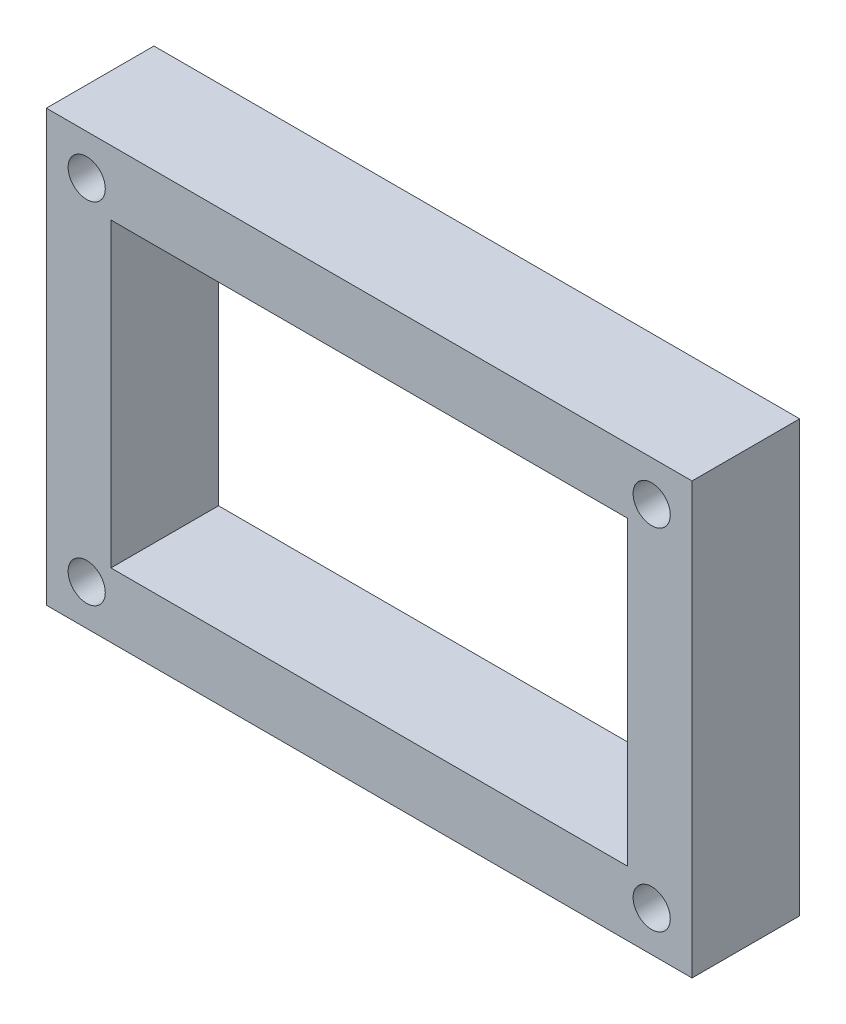
ISO-10303-21;
HEADER;
FILE_DESCRIPTION(('STEP AP214'),'2;1');
FILE_NAME('part.step','',(''),(''),'','','');
FILE_SCHEMA(('AUTOMOTIVE_DESIGN { 1 0 10303 214 1 1 1 1 }'));
ENDSEC;
DATA;
#1=APPLICATION_CONTEXT('core data for automotive mechanical design processes');
#2=APPLICATION_PROTOCOL_DEFINITION('international standard','automotive_design',2000,#1);
#3=PRODUCT_CONTEXT('',#1,'mechanical');
#4=PRODUCT('Part','Part','',(#3));
#5=PRODUCT_RELATED_PRODUCT_CATEGORY('part','',(#4));
#6=PRODUCT_DEFINITION_FORMATION('','',#4);
#7=PRODUCT_DEFINITION_CONTEXT('part definition',#1,'design');
#8=PRODUCT_DEFINITION('design','',#6,#7);
#9=PRODUCT_DEFINITION_SHAPE('','',#8);
#10=(LENGTH_UNIT() NAMED_UNIT(*) SI_UNIT(.MILLI.,.METRE.));
#11=(NAMED_UNIT(*) PLANE_ANGLE_UNIT() SI_UNIT($,.RADIAN.));
#12=(NAMED_UNIT(*) SI_UNIT($,.STERADIAN.) SOLID_ANGLE_UNIT());
#13=UNCERTAINTY_MEASURE_WITH_UNIT(LENGTH_MEASURE(1.E-05),#10,'distance_accuracy_value','');
#14=(GEOMETRIC_REPRESENTATION_CONTEXT(3) GLOBAL_UNCERTAINTY_ASSIGNED_CONTEXT((#13)) GLOBAL_UNIT_ASSIGNED_CONTEXT((#10,
#11,#12)) REPRESENTATION_CONTEXT('',''));
#15=CARTESIAN_POINT('',(0.,0.,0.));
#16=DIRECTION('',(0.,0.,1.));
#17=DIRECTION('',(1.,0.,0.));
#18=AXIS2_PLACEMENT_3D('',#15,#16,#17);
#19=CARTESIAN_POINT('',(0.,-20.,10.));
#20=DIRECTION('',(0.,-1.,0.));
#21=DIRECTION('',(1.,0.,0.));
#22=AXIS2_PLACEMENT_3D('',#19,#20,#21);
#23=PLANE('',#22);
#24=DIRECTION('',(-1.,0.,0.));
#25=VECTOR('',#24,1.);
#26=CARTESIAN_POINT('',(0.,-20.,0.));
#27=LINE('',#26,#25);
#28=CARTESIAN_POINT('',(30.,-20.,0.));
#29=VERTEX_POINT('',#28);
#30=CARTESIAN_POINT('',(-30.,-20.,0.));
#31=VERTEX_POINT('',#30);
#32=EDGE_CURVE('E221',#29,#31,#27,.T.);
#33=ORIENTED_EDGE('',*,*,#32,.F.);
#34=DIRECTION('',(0.,0.,-1.));
#35=VECTOR('',#34,1.);
#36=CARTESIAN_POINT('',(30.,-20.,10.));
#37=LINE('',#36,#35);
#38=CARTESIAN_POINT('',(30.,-20.,10.));
#39=VERTEX_POINT('',#38);
#40=EDGE_CURVE('E10',#39,#29,#37,.T.);
#41=ORIENTED_EDGE('',*,*,#40,.F.);
#42=DIRECTION('',(-1.,0.,0.));
#43=VECTOR('',#42,1.);
#44=CARTESIAN_POINT('',(0.,-20.,10.));
#45=LINE('',#44,#43);
#46=CARTESIAN_POINT('',(-30.,-20.,10.));
#47=VERTEX_POINT('',#46);
#48=EDGE_CURVE('E126',#39,#47,#45,.T.);
#49=ORIENTED_EDGE('',*,*,#48,.T.);
#50=DIRECTION('',(0.,0.,-1.));
#51=VECTOR('',#50,1.);
#52=CARTESIAN_POINT('',(-30.,-20.,10.));
#53=LINE('',#52,#51);
#54=EDGE_CURVE('E41',#47,#31,#53,.T.);
#55=ORIENTED_EDGE('',*,*,#54,.T.);
#56=EDGE_LOOP('',(#33,#41,#49,#55));
#57=FACE_BOUND('',#56,.T.);
#58=ADVANCED_FACE('F16',(#57),#23,.T.);
#59=CARTESIAN_POINT('',(30.,0.,10.));
#60=DIRECTION('',(-1.,0.,0.));
#61=DIRECTION('',(0.,0.,1.));
#62=AXIS2_PLACEMENT_3D('',#59,#60,#61);
#63=PLANE('',#62);
#64=DIRECTION('',(0.,1.,0.));
#65=VECTOR('',#64,1.);
#66=CARTESIAN_POINT('',(30.,0.,0.));
#67=LINE('',#66,#65);
#68=CARTESIAN_POINT('',(30.,20.,0.));
#69=VERTEX_POINT('',#68);
#70=EDGE_CURVE('E132',#29,#69,#67,.T.);
#71=ORIENTED_EDGE('',*,*,#70,.T.);
#72=DIRECTION('',(0.,0.,-1.));
#73=VECTOR('',#72,1.);
#74=CARTESIAN_POINT('',(30.,20.,10.));
#75=LINE('',#74,#73);
#76=CARTESIAN_POINT('',(30.,20.,10.));
#77=VERTEX_POINT('',#76);
#78=EDGE_CURVE('E27',#77,#69,#75,.T.);
#79=ORIENTED_EDGE('',*,*,#78,.F.);
#80=DIRECTION('',(0.,1.,0.));
#81=VECTOR('',#80,1.);
#82=CARTESIAN_POINT('',(30.,0.,10.));
#83=LINE('',#82,#81);
#84=EDGE_CURVE('E121',#39,#77,#83,.T.);
#85=ORIENTED_EDGE('',*,*,#84,.F.);
#86=ORIENTED_EDGE('',*,*,#40,.T.);
#87=EDGE_LOOP('',(#71,#79,#85,#86));
#88=FACE_BOUND('',#87,.T.);
#89=ADVANCED_FACE('F130',(#88),#63,.F.);
#90=CARTESIAN_POINT('',(0.,20.,10.));
#91=DIRECTION('',(0.,-1.,0.));
#92=DIRECTION('',(1.,0.,0.));
#93=AXIS2_PLACEMENT_3D('',#90,#91,#92);
#94=PLANE('',#93);
#95=DIRECTION('',(-1.,0.,0.));
#96=VECTOR('',#95,1.);
#97=CARTESIAN_POINT('',(0.,20.,0.));
#98=LINE('',#97,#96);
#99=CARTESIAN_POINT('',(-30.,20.,0.));
#100=VERTEX_POINT('',#99);
#101=EDGE_CURVE('E226',#69,#100,#98,.T.);
#102=ORIENTED_EDGE('',*,*,#101,.T.);
#103=DIRECTION('',(0.,0.,-1.));
#104=VECTOR('',#103,1.);
#105=CARTESIAN_POINT('',(-30.,20.,10.));
#106=LINE('',#105,#104);
#107=CARTESIAN_POINT('',(-30.,20.,10.));
#108=VERTEX_POINT('',#107);
#109=EDGE_CURVE('E76',#108,#100,#106,.T.);
#110=ORIENTED_EDGE('',*,*,#109,.F.);
#111=DIRECTION('',(-1.,0.,0.));
#112=VECTOR('',#111,1.);
#113=CARTESIAN_POINT('',(0.,20.,10.));
#114=LINE('',#113,#112);
#115=EDGE_CURVE('E112',#77,#108,#114,.T.);
#116=ORIENTED_EDGE('',*,*,#115,.F.);
#117=ORIENTED_EDGE('',*,*,#78,.T.);
#118=EDGE_LOOP('',(#102,#110,#116,#117));
#119=FACE_BOUND('',#118,.T.);
#120=ADVANCED_FACE('F114',(#119),#94,.F.);
#121=CARTESIAN_POINT('',(24.,0.,10.));
#122=DIRECTION('',(-1.,0.,0.));
#123=DIRECTION('',(0.,0.,1.));
#124=AXIS2_PLACEMENT_3D('',#121,#122,#123);
#125=PLANE('',#124);
#126=DIRECTION('',(0.,1.,0.));
#127=VECTOR('',#126,1.);
#128=CARTESIAN_POINT('',(24.,0.,0.));
#129=LINE('',#128,#127);
#130=CARTESIAN_POINT('',(24.,-14.,0.));
#131=VERTEX_POINT('',#130);
#132=CARTESIAN_POINT('',(24.,14.,0.));
#133=VERTEX_POINT('',#132);
#134=EDGE_CURVE('E157',#131,#133,#129,.T.);
#135=ORIENTED_EDGE('',*,*,#134,.F.);
#136=DIRECTION('',(0.,0.,-1.));
#137=VECTOR('',#136,1.);
#138=CARTESIAN_POINT('',(24.,-14.,10.));
#139=LINE('',#138,#137);
#140=CARTESIAN_POINT('',(24.,-14.,10.));
#141=VERTEX_POINT('',#140);
#142=EDGE_CURVE('E92',#141,#131,#139,.T.);
#143=ORIENTED_EDGE('',*,*,#142,.F.);
#144=DIRECTION('',(0.,1.,0.));
#145=VECTOR('',#144,1.);
#146=CARTESIAN_POINT('',(24.,0.,10.));
#147=LINE('',#146,#145);
#148=CARTESIAN_POINT('',(24.,14.,10.));
#149=VERTEX_POINT('',#148);
#150=EDGE_CURVE('E189',#141,#149,#147,.T.);
#151=ORIENTED_EDGE('',*,*,#150,.T.);
#152=DIRECTION('',(0.,0.,-1.));
#153=VECTOR('',#152,1.);
#154=CARTESIAN_POINT('',(24.,14.,10.));
#155=LINE('',#154,#153);
#156=EDGE_CURVE('E141',#149,#133,#155,.T.);
#157=ORIENTED_EDGE('',*,*,#156,.T.);
#158=EDGE_LOOP('',(#135,#143,#151,#157));
#159=FACE_BOUND('',#158,.T.);
#160=ADVANCED_FACE('F18',(#159),#125,.T.);
#161=CARTESIAN_POINT('',(0.,-14.,10.));
#162=DIRECTION('',(0.,-1.,0.));
#163=DIRECTION('',(1.,0.,0.));
#164=AXIS2_PLACEMENT_3D('',#161,#162,#163);
#165=PLANE('',#164);
#166=DIRECTION('',(-1.,0.,0.));
#167=VECTOR('',#166,1.);
#168=CARTESIAN_POINT('',(0.,-14.,0.));
#169=LINE('',#168,#167);
#170=CARTESIAN_POINT('',(-24.,-14.,0.));
#171=VERTEX_POINT('',#170);
#172=EDGE_CURVE('E210',#131,#171,#169,.T.);
#173=ORIENTED_EDGE('',*,*,#172,.T.);
#174=DIRECTION('',(0.,0.,-1.));
#175=VECTOR('',#174,1.);
#176=CARTESIAN_POINT('',(-24.,-14.,10.));
#177=LINE('',#176,#175);
#178=CARTESIAN_POINT('',(-24.,-14.,10.));
#179=VERTEX_POINT('',#178);
#180=EDGE_CURVE('E147',#179,#171,#177,.T.);
#181=ORIENTED_EDGE('',*,*,#180,.F.);
#182=DIRECTION('',(-1.,0.,0.));
#183=VECTOR('',#182,1.);
#184=CARTESIAN_POINT('',(0.,-14.,10.));
#185=LINE('',#184,#183);
#186=EDGE_CURVE('E192',#141,#179,#185,.T.);
#187=ORIENTED_EDGE('',*,*,#186,.F.);
#188=ORIENTED_EDGE('',*,*,#142,.T.);
#189=EDGE_LOOP('',(#173,#181,#187,#188));
#190=FACE_BOUND('',#189,.T.);
#191=ADVANCED_FACE('F267',(#190),#165,.F.);
#192=CARTESIAN_POINT('',(-24.,0.,10.));
#193=DIRECTION('',(-1.,0.,0.));
#194=DIRECTION('',(0.,0.,1.));
#195=AXIS2_PLACEMENT_3D('',#192,#193,#194);
#196=PLANE('',#195);
#197=DIRECTION('',(0.,1.,0.));
#198=VECTOR('',#197,1.);
#199=CARTESIAN_POINT('',(-24.,0.,0.));
#200=LINE('',#199,#198);
#201=CARTESIAN_POINT('',(-24.,14.,0.));
#202=VERTEX_POINT('',#201);
#203=EDGE_CURVE('E213',#171,#202,#200,.T.);
#204=ORIENTED_EDGE('',*,*,#203,.T.);
#205=DIRECTION('',(0.,0.,-1.));
#206=VECTOR('',#205,1.);
#207=CARTESIAN_POINT('',(-24.,14.,10.));
#208=LINE('',#207,#206);
#209=CARTESIAN_POINT('',(-24.,14.,10.));
#210=VERTEX_POINT('',#209);
#211=EDGE_CURVE('E144',#210,#202,#208,.T.);
#212=ORIENTED_EDGE('',*,*,#211,.F.);
#213=DIRECTION('',(0.,1.,0.));
#214=VECTOR('',#213,1.);
#215=CARTESIAN_POINT('',(-24.,0.,10.));
#216=LINE('',#215,#214);
#217=EDGE_CURVE('E196',#179,#210,#216,.T.);
#218=ORIENTED_EDGE('',*,*,#217,.F.);
#219=ORIENTED_EDGE('',*,*,#180,.T.);
#220=EDGE_LOOP('',(#204,#212,#218,#219));
#221=FACE_BOUND('',#220,.T.);
#222=ADVANCED_FACE('F254',(#221),#196,.F.);
#223=CARTESIAN_POINT('',(0.,14.,10.));
#224=DIRECTION('',(0.,-1.,0.));
#225=DIRECTION('',(1.,0.,0.));
#226=AXIS2_PLACEMENT_3D('',#223,#224,#225);
#227=PLANE('',#226);
#228=DIRECTION('',(-1.,0.,0.));
#229=VECTOR('',#228,1.);
#230=CARTESIAN_POINT('',(0.,14.,0.));
#231=LINE('',#230,#229);
#232=EDGE_CURVE('E217',#133,#202,#231,.T.);
#233=ORIENTED_EDGE('',*,*,#232,.F.);
#234=ORIENTED_EDGE('',*,*,#156,.F.);
#235=DIRECTION('',(-1.,0.,0.));
#236=VECTOR('',#235,1.);
#237=CARTESIAN_POINT('',(0.,14.,10.));
#238=LINE('',#237,#236);
#239=EDGE_CURVE('E199',#149,#210,#238,.T.);
#240=ORIENTED_EDGE('',*,*,#239,.T.);
#241=ORIENTED_EDGE('',*,*,#211,.T.);
#242=EDGE_LOOP('',(#233,#234,#240,#241));
#243=FACE_BOUND('',#242,.T.);
#244=ADVANCED_FACE('F245',(#243),#227,.T.);
#245=CARTESIAN_POINT('',(-30.,0.,10.));
#246=DIRECTION('',(-1.,0.,0.));
#247=DIRECTION('',(0.,0.,1.));
#248=AXIS2_PLACEMENT_3D('',#245,#246,#247);
#249=PLANE('',#248);
#250=DIRECTION('',(0.,1.,0.));
#251=VECTOR('',#250,1.);
#252=CARTESIAN_POINT('',(-30.,0.,0.));
#253=LINE('',#252,#251);
#254=EDGE_CURVE('E193',#31,#100,#253,.T.);
#255=ORIENTED_EDGE('',*,*,#254,.F.);
#256=ORIENTED_EDGE('',*,*,#54,.F.);
#257=DIRECTION('',(0.,1.,0.));
#258=VECTOR('',#257,1.);
#259=CARTESIAN_POINT('',(-30.,0.,10.));
#260=LINE('',#259,#258);
#261=EDGE_CURVE('E120',#47,#108,#260,.T.);
#262=ORIENTED_EDGE('',*,*,#261,.T.);
#263=ORIENTED_EDGE('',*,*,#109,.T.);
#264=EDGE_LOOP('',(#255,#256,#262,#263));
#265=FACE_BOUND('',#264,.T.);
#266=ADVANCED_FACE('F243',(#265),#249,.T.);
#267=CARTESIAN_POINT('',(0.,0.,10.));
#268=DIRECTION('',(0.,0.,1.));
#269=DIRECTION('',(1.,0.,0.));
#270=AXIS2_PLACEMENT_3D('',#267,#268,#269);
#271=PLANE('',#270);
#272=CARTESIAN_POINT('',(26.25,16.25,10.));
#273=DIRECTION('',(0.,0.,1.));
#274=DIRECTION('',(-1.,0.,0.));
#275=AXIS2_PLACEMENT_3D('',#272,#273,#274);
#276=CIRCLE('',#275,1.727);
#277=CARTESIAN_POINT('',(24.523,16.25,10.));
#278=VERTEX_POINT('',#277);
#279=EDGE_CURVE('E183',#278,#278,#276,.T.);
#280=ORIENTED_EDGE('',*,*,#279,.F.);
#281=EDGE_LOOP('',(#280));
#282=FACE_BOUND('',#281,.T.);
#283=CARTESIAN_POINT('',(26.25,-16.25,10.));
#284=DIRECTION('',(0.,0.,-1.));
#285=DIRECTION('',(-1.,0.,0.));
#286=AXIS2_PLACEMENT_3D('',#283,#284,#285);
#287=CIRCLE('',#286,1.727);
#288=CARTESIAN_POINT('',(24.523,-16.25,10.));
#289=VERTEX_POINT('',#288);
#290=EDGE_CURVE('E166',#289,#289,#287,.T.);
#291=ORIENTED_EDGE('',*,*,#290,.T.);
#292=EDGE_LOOP('',(#291));
#293=FACE_BOUND('',#292,.T.);
#294=CARTESIAN_POINT('',(-26.25,16.25,10.));
#295=DIRECTION('',(0.,0.,-1.));
#296=DIRECTION('',(1.,0.,0.));
#297=AXIS2_PLACEMENT_3D('',#294,#295,#296);
#298=CIRCLE('',#297,1.727);
#299=CARTESIAN_POINT('',(-24.523,16.25,10.));
#300=VERTEX_POINT('',#299);
#301=EDGE_CURVE('E162',#300,#300,#298,.T.);
#302=ORIENTED_EDGE('',*,*,#301,.T.);
#303=EDGE_LOOP('',(#302));
#304=FACE_BOUND('',#303,.T.);
#305=CARTESIAN_POINT('',(-26.25,-16.25,10.));
#306=DIRECTION('',(0.,0.,1.));
#307=DIRECTION('',(1.,0.,0.));
#308=AXIS2_PLACEMENT_3D('',#305,#306,#307);
#309=CIRCLE('',#308,1.727);
#310=CARTESIAN_POINT('',(-24.523,-16.25,10.));
#311=VERTEX_POINT('',#310);
#312=EDGE_CURVE('E158',#311,#311,#309,.T.);
#313=ORIENTED_EDGE('',*,*,#312,.F.);
#314=EDGE_LOOP('',(#313));
#315=FACE_BOUND('',#314,.T.);
#316=ORIENTED_EDGE('',*,*,#150,.F.);
#317=ORIENTED_EDGE('',*,*,#186,.T.);
#318=ORIENTED_EDGE('',*,*,#217,.T.);
#319=ORIENTED_EDGE('',*,*,#239,.F.);
#320=EDGE_LOOP('',(#316,#317,#318,#319));
#321=FACE_BOUND('',#320,.T.);
#322=ORIENTED_EDGE('',*,*,#48,.F.);
#323=ORIENTED_EDGE('',*,*,#84,.T.);
#324=ORIENTED_EDGE('',*,*,#115,.T.);
#325=ORIENTED_EDGE('',*,*,#261,.F.);
#326=EDGE_LOOP('',(#322,#323,#324,#325));
#327=FACE_BOUND('',#326,.T.);
#328=ADVANCED_FACE('F125',(#282,#293,#304,#315,#321,#327),#271,.T.);
#329=CARTESIAN_POINT('',(0.,0.,0.));
#330=DIRECTION('',(0.,0.,1.));
#331=DIRECTION('',(1.,0.,0.));
#332=AXIS2_PLACEMENT_3D('',#329,#330,#331);
#333=PLANE('',#332);
#334=CARTESIAN_POINT('',(26.25,16.25,0.));
#335=DIRECTION('',(0.,0.,1.));
#336=DIRECTION('',(1.,0.,0.));
#337=AXIS2_PLACEMENT_3D('',#334,#335,#336);
#338=CIRCLE('',#337,1.727);
#339=CARTESIAN_POINT('',(27.977,16.25,0.));
#340=VERTEX_POINT('',#339);
#341=EDGE_CURVE('E20',#340,#340,#338,.T.);
#342=ORIENTED_EDGE('',*,*,#341,.T.);
#343=EDGE_LOOP('',(#342));
#344=FACE_BOUND('',#343,.T.);
#345=CARTESIAN_POINT('',(26.25,-16.25,0.));
#346=DIRECTION('',(0.,0.,1.));
#347=DIRECTION('',(1.,0.,0.));
#348=AXIS2_PLACEMENT_3D('',#345,#346,#347);
#349=CIRCLE('',#348,1.727);
#350=CARTESIAN_POINT('',(27.977,-16.25,0.));
#351=VERTEX_POINT('',#350);
#352=EDGE_CURVE('E163',#351,#351,#349,.F.);
#353=ORIENTED_EDGE('',*,*,#352,.F.);
#354=EDGE_LOOP('',(#353));
#355=FACE_BOUND('',#354,.T.);
#356=CARTESIAN_POINT('',(-26.25,16.25,0.));
#357=DIRECTION('',(0.,0.,1.));
#358=DIRECTION('',(1.,0.,0.));
#359=AXIS2_PLACEMENT_3D('',#356,#357,#358);
#360=CIRCLE('',#359,1.727);
#361=CARTESIAN_POINT('',(-24.523,16.25,0.));
#362=VERTEX_POINT('',#361);
#363=EDGE_CURVE('E159',#362,#362,#360,.F.);
#364=ORIENTED_EDGE('',*,*,#363,.F.);
#365=EDGE_LOOP('',(#364));
#366=FACE_BOUND('',#365,.T.);
#367=CARTESIAN_POINT('',(-26.25,-16.25,0.));
#368=DIRECTION('',(0.,0.,1.));
#369=DIRECTION('',(1.,0.,0.));
#370=AXIS2_PLACEMENT_3D('',#367,#368,#369);
#371=CIRCLE('',#370,1.727);
#372=CARTESIAN_POINT('',(-24.523,-16.25,0.));
#373=VERTEX_POINT('',#372);
#374=EDGE_CURVE('E153',#373,#373,#371,.T.);
#375=ORIENTED_EDGE('',*,*,#374,.T.);
#376=EDGE_LOOP('',(#375));
#377=FACE_BOUND('',#376,.T.);
#378=ORIENTED_EDGE('',*,*,#134,.T.);
#379=ORIENTED_EDGE('',*,*,#232,.T.);
#380=ORIENTED_EDGE('',*,*,#203,.F.);
#381=ORIENTED_EDGE('',*,*,#172,.F.);
#382=EDGE_LOOP('',(#378,#379,#380,#381));
#383=FACE_BOUND('',#382,.T.);
#384=ORIENTED_EDGE('',*,*,#32,.T.);
#385=ORIENTED_EDGE('',*,*,#254,.T.);
#386=ORIENTED_EDGE('',*,*,#101,.F.);
#387=ORIENTED_EDGE('',*,*,#70,.F.);
#388=EDGE_LOOP('',(#384,#385,#386,#387));
#389=FACE_BOUND('',#388,.T.);
#390=ADVANCED_FACE('F242',(#344,#355,#366,#377,#383,#389),#333,.F.);
#391=CARTESIAN_POINT('',(-26.25,-16.25,-62.8110988928052));
#392=DIRECTION('',(0.,0.,1.));
#393=DIRECTION('',(1.,0.,0.));
#394=AXIS2_PLACEMENT_3D('',#391,#392,#393);
#395=CYLINDRICAL_SURFACE('',#394,1.727);
#396=ORIENTED_EDGE('',*,*,#312,.T.);
#397=EDGE_LOOP('',(#396));
#398=FACE_BOUND('',#397,.T.);
#399=ORIENTED_EDGE('',*,*,#374,.F.);
#400=EDGE_LOOP('',(#399));
#401=FACE_BOUND('',#400,.T.);
#402=ADVANCED_FACE('F285',(#398,#401),#395,.F.);
#403=CARTESIAN_POINT('',(-26.25,16.25,-62.8110988928052));
#404=DIRECTION('',(0.,0.,1.));
#405=DIRECTION('',(1.,0.,0.));
#406=AXIS2_PLACEMENT_3D('',#403,#404,#405);
#407=CYLINDRICAL_SURFACE('',#406,1.727);
#408=ORIENTED_EDGE('',*,*,#301,.F.);
#409=EDGE_LOOP('',(#408));
#410=FACE_BOUND('',#409,.T.);
#411=ORIENTED_EDGE('',*,*,#363,.T.);
#412=EDGE_LOOP('',(#411));
#413=FACE_BOUND('',#412,.T.);
#414=ADVANCED_FACE('F290',(#410,#413),#407,.F.);
#415=CARTESIAN_POINT('',(26.25,-16.25,-62.8110988928052));
#416=DIRECTION('',(0.,0.,1.));
#417=DIRECTION('',(1.,0.,0.));
#418=AXIS2_PLACEMENT_3D('',#415,#416,#417);
#419=CYLINDRICAL_SURFACE('',#418,1.727);
#420=ORIENTED_EDGE('',*,*,#290,.F.);
#421=EDGE_LOOP('',(#420));
#422=FACE_BOUND('',#421,.T.);
#423=ORIENTED_EDGE('',*,*,#352,.T.);
#424=EDGE_LOOP('',(#423));
#425=FACE_BOUND('',#424,.T.);
#426=ADVANCED_FACE('F297',(#422,#425),#419,.F.);
#427=CARTESIAN_POINT('',(26.25,16.25,-62.8110988928052));
#428=DIRECTION('',(0.,0.,1.));
#429=DIRECTION('',(1.,0.,0.));
#430=AXIS2_PLACEMENT_3D('',#427,#428,#429);
#431=CYLINDRICAL_SURFACE('',#430,1.727);
#432=ORIENTED_EDGE('',*,*,#279,.T.);
#433=EDGE_LOOP('',(#432));
#434=FACE_BOUND('',#433,.T.);
#435=ORIENTED_EDGE('',*,*,#341,.F.);
#436=EDGE_LOOP('',(#435));
#437=FACE_BOUND('',#436,.T.);
#438=ADVANCED_FACE('F301',(#434,#437),#431,.F.);
#439=CLOSED_SHELL('',(#58,#89,#120,#160,#191,#222,#244,#266,#328,#390,#402,#414,#426,#438));
#440=MANIFOLD_SOLID_BREP('B1',#439);
#441=ADVANCED_BREP_SHAPE_REPRESENTATION('',(#18,#440),#14);
#442=SHAPE_DEFINITION_REPRESENTATION(#9,#441);
ENDSEC;
END-ISO-10303-21;
